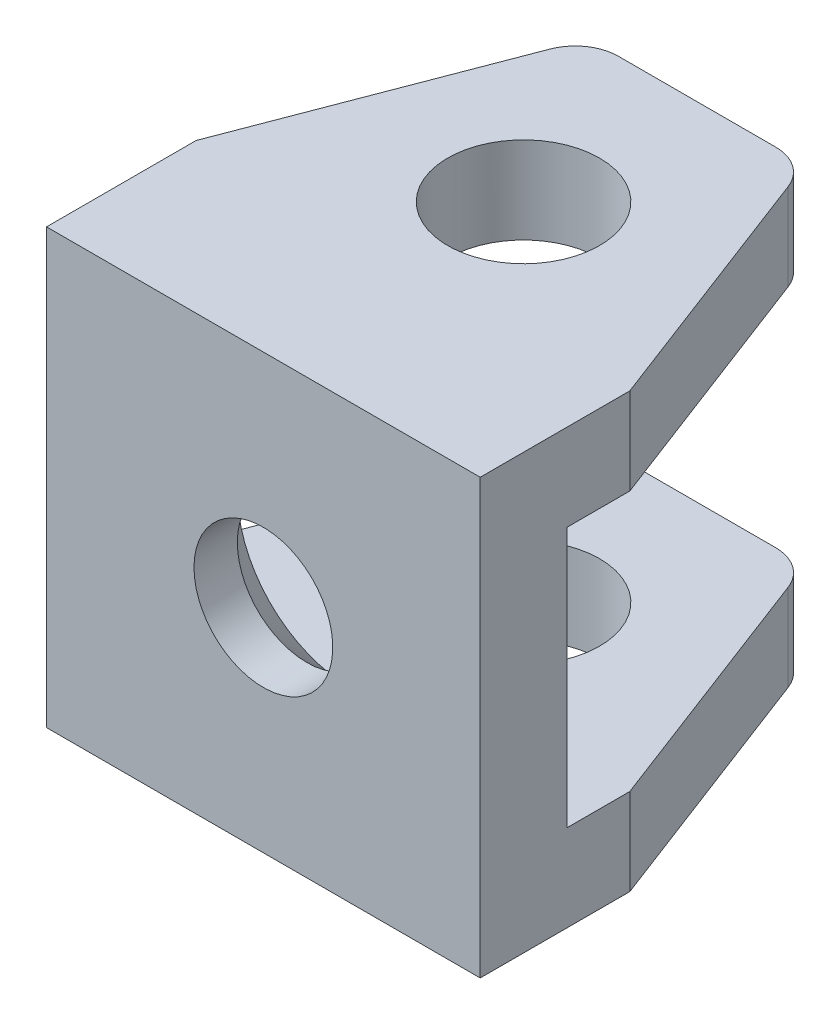
ISO-10303-21;
HEADER;
FILE_DESCRIPTION(('STEP AP214'),'2;1');
FILE_NAME('part.step','',(''),(''),'','','');
FILE_SCHEMA(('AUTOMOTIVE_DESIGN { 1 0 10303 214 1 1 1 1 }'));
ENDSEC;
DATA;
#1=APPLICATION_CONTEXT('core data for automotive mechanical design processes');
#2=APPLICATION_PROTOCOL_DEFINITION('international standard','automotive_design',2000,#1);
#3=PRODUCT_CONTEXT('',#1,'mechanical');
#4=PRODUCT('Part','Part','',(#3));
#5=PRODUCT_RELATED_PRODUCT_CATEGORY('part','',(#4));
#6=PRODUCT_DEFINITION_FORMATION('','',#4);
#7=PRODUCT_DEFINITION_CONTEXT('part definition',#1,'design');
#8=PRODUCT_DEFINITION('design','',#6,#7);
#9=PRODUCT_DEFINITION_SHAPE('','',#8);
#10=(LENGTH_UNIT() NAMED_UNIT(*) SI_UNIT(.MILLI.,.METRE.));
#11=(NAMED_UNIT(*) PLANE_ANGLE_UNIT() SI_UNIT($,.RADIAN.));
#12=(NAMED_UNIT(*) SI_UNIT($,.STERADIAN.) SOLID_ANGLE_UNIT());
#13=UNCERTAINTY_MEASURE_WITH_UNIT(LENGTH_MEASURE(1.E-05),#10,'distance_accuracy_value','');
#14=(GEOMETRIC_REPRESENTATION_CONTEXT(3) GLOBAL_UNCERTAINTY_ASSIGNED_CONTEXT((#13)) GLOBAL_UNIT_ASSIGNED_CONTEXT((#10,
#11,#12)) REPRESENTATION_CONTEXT('',''));
#15=CARTESIAN_POINT('',(0.,0.,0.));
#16=DIRECTION('',(0.,0.,1.));
#17=DIRECTION('',(1.,0.,0.));
#18=AXIS2_PLACEMENT_3D('',#15,#16,#17);
#19=CARTESIAN_POINT('',(2.5,10.,-5.));
#20=DIRECTION('',(-0.934277027827798,0.,0.356547942461117));
#21=DIRECTION('',(0.356547942461117,0.,0.934277027827798));
#22=AXIS2_PLACEMENT_3D('',#19,#20,#21);
#23=PLANE('',#22);
#24=DIRECTION('',(-0.356547942461117,0.,-0.934277027827798));
#25=VECTOR('',#24,1.);
#26=CARTESIAN_POINT('',(2.5,8.,-5.));
#27=LINE('',#26,#25);
#28=CARTESIAN_POINT('',(5.,8.,1.55085134820043));
#29=VERTEX_POINT('',#28);
#30=CARTESIAN_POINT('',(2.74556047120335,8.,-4.35654794246112));
#31=VERTEX_POINT('',#30);
#32=EDGE_CURVE('E218',#29,#31,#27,.T.);
#33=ORIENTED_EDGE('',*,*,#32,.T.);
#34=DIRECTION('',(0.,-1.,0.));
#35=VECTOR('',#34,1.);
#36=CARTESIAN_POINT('',(2.74556047120335,10.,-4.35654794246112));
#37=LINE('',#36,#35);
#38=CARTESIAN_POINT('',(2.74556047120335,10.,-4.35654794246112));
#39=VERTEX_POINT('',#38);
#40=EDGE_CURVE('E315',#31,#39,#37,.F.);
#41=ORIENTED_EDGE('',*,*,#40,.T.);
#42=DIRECTION('',(-0.356547942461117,0.,-0.934277027827798));
#43=VECTOR('',#42,1.);
#44=CARTESIAN_POINT('',(2.5,10.,-5.));
#45=LINE('',#44,#43);
#46=CARTESIAN_POINT('',(5.,10.,1.55085134820043));
#47=VERTEX_POINT('',#46);
#48=EDGE_CURVE('E234',#47,#39,#45,.T.);
#49=ORIENTED_EDGE('',*,*,#48,.F.);
#50=DIRECTION('',(0.,-1.,0.));
#51=VECTOR('',#50,1.);
#52=CARTESIAN_POINT('',(5.,10.,1.55085134820043));
#53=LINE('',#52,#51);
#54=EDGE_CURVE('E268',#47,#29,#53,.T.);
#55=ORIENTED_EDGE('',*,*,#54,.T.);
#56=EDGE_LOOP('',(#33,#41,#49,#55));
#57=FACE_BOUND('',#56,.T.);
#58=ADVANCED_FACE('F44',(#57),#23,.F.);
#59=CARTESIAN_POINT('',(-2.5,10.,-5.));
#60=DIRECTION('',(0.,0.,1.));
#61=DIRECTION('',(1.,0.,0.));
#62=AXIS2_PLACEMENT_3D('',#59,#60,#61);
#63=PLANE('',#62);
#64=DIRECTION('',(1.,0.,0.));
#65=VECTOR('',#64,1.);
#66=CARTESIAN_POINT('',(-5.,8.,-5.));
#67=LINE('',#66,#65);
#68=CARTESIAN_POINT('',(-1.81128344337555,8.,-5.));
#69=VERTEX_POINT('',#68);
#70=CARTESIAN_POINT('',(1.81128344337555,8.,-5.));
#71=VERTEX_POINT('',#70);
#72=EDGE_CURVE('E206',#69,#71,#67,.T.);
#73=ORIENTED_EDGE('',*,*,#72,.F.);
#74=DIRECTION('',(0.,-1.,0.));
#75=VECTOR('',#74,1.);
#76=CARTESIAN_POINT('',(-1.81128344337555,10.,-5.));
#77=LINE('',#76,#75);
#78=CARTESIAN_POINT('',(-1.81128344337555,10.,-5.));
#79=VERTEX_POINT('',#78);
#80=EDGE_CURVE('E306',#69,#79,#77,.F.);
#81=ORIENTED_EDGE('',*,*,#80,.T.);
#82=DIRECTION('',(-1.,0.,0.));
#83=VECTOR('',#82,1.);
#84=CARTESIAN_POINT('',(-2.5,10.,-5.));
#85=LINE('',#84,#83);
#86=CARTESIAN_POINT('',(1.81128344337555,10.,-5.));
#87=VERTEX_POINT('',#86);
#88=EDGE_CURVE('E238',#87,#79,#85,.T.);
#89=ORIENTED_EDGE('',*,*,#88,.F.);
#90=DIRECTION('',(0.,-1.,0.));
#91=VECTOR('',#90,1.);
#92=CARTESIAN_POINT('',(1.81128344337555,10.,-5.));
#93=LINE('',#92,#91);
#94=EDGE_CURVE('E302',#87,#71,#93,.T.);
#95=ORIENTED_EDGE('',*,*,#94,.T.);
#96=EDGE_LOOP('',(#73,#81,#89,#95));
#97=FACE_BOUND('',#96,.T.);
#98=ADVANCED_FACE('F357',(#97),#63,.F.);
#99=CARTESIAN_POINT('',(-2.5,10.,-5.));
#100=DIRECTION('',(0.934277027827798,0.,0.356547942461117));
#101=DIRECTION('',(0.356547942461117,0.,-0.934277027827798));
#102=AXIS2_PLACEMENT_3D('',#99,#100,#101);
#103=PLANE('',#102);
#104=DIRECTION('',(-0.356547942461117,0.,0.934277027827798));
#105=VECTOR('',#104,1.);
#106=CARTESIAN_POINT('',(-2.5,10.,-5.));
#107=LINE('',#106,#105);
#108=CARTESIAN_POINT('',(-2.74556047120335,10.,-4.35654794246112));
#109=VERTEX_POINT('',#108);
#110=CARTESIAN_POINT('',(-5.,10.,1.55085134820043));
#111=VERTEX_POINT('',#110);
#112=EDGE_CURVE('E242',#109,#111,#107,.T.);
#113=ORIENTED_EDGE('',*,*,#112,.F.);
#114=DIRECTION('',(0.,-1.,0.));
#115=VECTOR('',#114,1.);
#116=CARTESIAN_POINT('',(-2.74556047120335,10.,-4.35654794246112));
#117=LINE('',#116,#115);
#118=CARTESIAN_POINT('',(-2.74556047120335,8.,-4.35654794246112));
#119=VERTEX_POINT('',#118);
#120=EDGE_CURVE('E287',#109,#119,#117,.T.);
#121=ORIENTED_EDGE('',*,*,#120,.T.);
#122=DIRECTION('',(-0.356547942461117,0.,0.934277027827798));
#123=VECTOR('',#122,1.);
#124=CARTESIAN_POINT('',(-2.5,8.,-5.));
#125=LINE('',#124,#123);
#126=CARTESIAN_POINT('',(-5.,8.,1.55085134820042));
#127=VERTEX_POINT('',#126);
#128=EDGE_CURVE('E284',#119,#127,#125,.T.);
#129=ORIENTED_EDGE('',*,*,#128,.T.);
#130=DIRECTION('',(0.,-1.,0.));
#131=VECTOR('',#130,1.);
#132=CARTESIAN_POINT('',(-5.,10.,1.55085134820043));
#133=LINE('',#132,#131);
#134=EDGE_CURVE('E188',#111,#127,#133,.T.);
#135=ORIENTED_EDGE('',*,*,#134,.F.);
#136=EDGE_LOOP('',(#113,#121,#129,#135));
#137=FACE_BOUND('',#136,.T.);
#138=ADVANCED_FACE('F364',(#137),#103,.F.);
#139=CARTESIAN_POINT('',(-5.,10.,5.));
#140=DIRECTION('',(1.,0.,0.));
#141=DIRECTION('',(0.,0.,-1.));
#142=AXIS2_PLACEMENT_3D('',#139,#140,#141);
#143=PLANE('',#142);
#144=ORIENTED_EDGE('',*,*,#134,.T.);
#145=DIRECTION('',(0.,0.,1.));
#146=VECTOR('',#145,1.);
#147=CARTESIAN_POINT('',(-5.,8.,-5.));
#148=LINE('',#147,#146);
#149=CARTESIAN_POINT('',(-5.,8.,2.99999999999999));
#150=VERTEX_POINT('',#149);
#151=EDGE_CURVE('E166',#127,#150,#148,.T.);
#152=ORIENTED_EDGE('',*,*,#151,.T.);
#153=DIRECTION('',(0.,-1.,0.));
#154=VECTOR('',#153,1.);
#155=CARTESIAN_POINT('',(-5.,8.,2.99999999999999));
#156=LINE('',#155,#154);
#157=CARTESIAN_POINT('',(-5.,2.,2.99999999999999));
#158=VERTEX_POINT('',#157);
#159=EDGE_CURVE('E178',#150,#158,#156,.T.);
#160=ORIENTED_EDGE('',*,*,#159,.T.);
#161=DIRECTION('',(0.,0.,-1.));
#162=VECTOR('',#161,1.);
#163=CARTESIAN_POINT('',(-5.,2.,-5.));
#164=LINE('',#163,#162);
#165=CARTESIAN_POINT('',(-5.,2.,1.55085134820042));
#166=VERTEX_POINT('',#165);
#167=EDGE_CURVE('E175',#158,#166,#164,.T.);
#168=ORIENTED_EDGE('',*,*,#167,.T.);
#169=CARTESIAN_POINT('',(-5.,0.,1.55085134820043));
#170=VERTEX_POINT('',#169);
#171=EDGE_CURVE('E245',#166,#170,#133,.T.);
#172=ORIENTED_EDGE('',*,*,#171,.T.);
#173=DIRECTION('',(0.,0.,1.));
#174=VECTOR('',#173,1.);
#175=CARTESIAN_POINT('',(-5.,0.,5.));
#176=LINE('',#175,#174);
#177=CARTESIAN_POINT('',(-5.,0.,5.));
#178=VERTEX_POINT('',#177);
#179=EDGE_CURVE('E222',#170,#178,#176,.T.);
#180=ORIENTED_EDGE('',*,*,#179,.T.);
#181=DIRECTION('',(0.,-1.,0.));
#182=VECTOR('',#181,1.);
#183=CARTESIAN_POINT('',(-5.,10.,5.));
#184=LINE('',#183,#182);
#185=CARTESIAN_POINT('',(-5.,10.,5.));
#186=VERTEX_POINT('',#185);
#187=EDGE_CURVE('E276',#186,#178,#184,.T.);
#188=ORIENTED_EDGE('',*,*,#187,.F.);
#189=DIRECTION('',(0.,0.,1.));
#190=VECTOR('',#189,1.);
#191=CARTESIAN_POINT('',(-5.,10.,5.));
#192=LINE('',#191,#190);
#193=EDGE_CURVE('E223',#111,#186,#192,.T.);
#194=ORIENTED_EDGE('',*,*,#193,.F.);
#195=EDGE_LOOP('',(#144,#152,#160,#168,#172,#180,#188,#194));
#196=FACE_BOUND('',#195,.T.);
#197=ADVANCED_FACE('F185',(#196),#143,.F.);
#198=CARTESIAN_POINT('',(-5.,10.,5.));
#199=DIRECTION('',(0.,0.,-1.));
#200=DIRECTION('',(-1.,0.,0.));
#201=AXIS2_PLACEMENT_3D('',#198,#199,#200);
#202=PLANE('',#201);
#203=CARTESIAN_POINT('',(0.,4.90081416804579,5.));
#204=DIRECTION('',(0.,0.,-1.));
#205=DIRECTION('',(-1.,0.,0.));
#206=AXIS2_PLACEMENT_3D('',#203,#204,#205);
#207=CIRCLE('',#206,1.6);
#208=CARTESIAN_POINT('',(-1.6,4.90081416804579,5.));
#209=VERTEX_POINT('',#208);
#210=EDGE_CURVE('E625',#209,#209,#207,.T.);
#211=ORIENTED_EDGE('',*,*,#210,.T.);
#212=EDGE_LOOP('',(#211));
#213=FACE_BOUND('',#212,.T.);
#214=DIRECTION('',(1.,0.,0.));
#215=VECTOR('',#214,1.);
#216=CARTESIAN_POINT('',(-5.,0.,5.));
#217=LINE('',#216,#215);
#218=CARTESIAN_POINT('',(5.,0.,5.));
#219=VERTEX_POINT('',#218);
#220=EDGE_CURVE('E249',#178,#219,#217,.T.);
#221=ORIENTED_EDGE('',*,*,#220,.T.);
#222=DIRECTION('',(0.,-1.,0.));
#223=VECTOR('',#222,1.);
#224=CARTESIAN_POINT('',(5.,10.,5.));
#225=LINE('',#224,#223);
#226=CARTESIAN_POINT('',(5.,10.,5.));
#227=VERTEX_POINT('',#226);
#228=EDGE_CURVE('E272',#227,#219,#225,.T.);
#229=ORIENTED_EDGE('',*,*,#228,.F.);
#230=DIRECTION('',(1.,0.,0.));
#231=VECTOR('',#230,1.);
#232=CARTESIAN_POINT('',(-5.,10.,5.));
#233=LINE('',#232,#231);
#234=EDGE_CURVE('E227',#186,#227,#233,.T.);
#235=ORIENTED_EDGE('',*,*,#234,.F.);
#236=ORIENTED_EDGE('',*,*,#187,.T.);
#237=EDGE_LOOP('',(#221,#229,#235,#236));
#238=FACE_BOUND('',#237,.T.);
#239=ADVANCED_FACE('F377',(#213,#238),#202,.F.);
#240=CARTESIAN_POINT('',(5.,10.,5.));
#241=DIRECTION('',(-1.,0.,0.));
#242=DIRECTION('',(0.,0.,1.));
#243=AXIS2_PLACEMENT_3D('',#240,#241,#242);
#244=PLANE('',#243);
#245=DIRECTION('',(0.,-1.,0.));
#246=VECTOR('',#245,1.);
#247=CARTESIAN_POINT('',(5.,8.,3.));
#248=LINE('',#247,#246);
#249=CARTESIAN_POINT('',(5.,8.,3.));
#250=VERTEX_POINT('',#249);
#251=CARTESIAN_POINT('',(5.,2.,3.));
#252=VERTEX_POINT('',#251);
#253=EDGE_CURVE('E194',#250,#252,#248,.T.);
#254=ORIENTED_EDGE('',*,*,#253,.F.);
#255=DIRECTION('',(0.,0.,1.));
#256=VECTOR('',#255,1.);
#257=CARTESIAN_POINT('',(5.,8.,-5.));
#258=LINE('',#257,#256);
#259=EDGE_CURVE('E169',#29,#250,#258,.T.);
#260=ORIENTED_EDGE('',*,*,#259,.F.);
#261=ORIENTED_EDGE('',*,*,#54,.F.);
#262=DIRECTION('',(0.,0.,-1.));
#263=VECTOR('',#262,1.);
#264=CARTESIAN_POINT('',(5.,10.,5.));
#265=LINE('',#264,#263);
#266=EDGE_CURVE('E231',#227,#47,#265,.T.);
#267=ORIENTED_EDGE('',*,*,#266,.F.);
#268=ORIENTED_EDGE('',*,*,#228,.T.);
#269=DIRECTION('',(0.,0.,-1.));
#270=VECTOR('',#269,1.);
#271=CARTESIAN_POINT('',(5.,0.,5.));
#272=LINE('',#271,#270);
#273=CARTESIAN_POINT('',(5.,0.,1.55085134820043));
#274=VERTEX_POINT('',#273);
#275=EDGE_CURVE('E252',#219,#274,#272,.T.);
#276=ORIENTED_EDGE('',*,*,#275,.T.);
#277=CARTESIAN_POINT('',(5.,2.,1.55085134820043));
#278=VERTEX_POINT('',#277);
#279=EDGE_CURVE('E267',#278,#274,#53,.T.);
#280=ORIENTED_EDGE('',*,*,#279,.F.);
#281=DIRECTION('',(0.,0.,-1.));
#282=VECTOR('',#281,1.);
#283=CARTESIAN_POINT('',(5.,2.,-5.));
#284=LINE('',#283,#282);
#285=EDGE_CURVE('E190',#252,#278,#284,.T.);
#286=ORIENTED_EDGE('',*,*,#285,.F.);
#287=EDGE_LOOP('',(#254,#260,#261,#267,#268,#276,#280,#286));
#288=FACE_BOUND('',#287,.T.);
#289=ADVANCED_FACE('F370',(#288),#244,.F.);
#290=DIRECTION('',(-0.356547942461117,0.,-0.934277027827798));
#291=VECTOR('',#290,1.);
#292=CARTESIAN_POINT('',(2.5,0.,-5.));
#293=LINE('',#292,#291);
#294=CARTESIAN_POINT('',(2.74556047120335,0.,-4.35654794246112));
#295=VERTEX_POINT('',#294);
#296=EDGE_CURVE('E256',#274,#295,#293,.T.);
#297=ORIENTED_EDGE('',*,*,#296,.T.);
#298=DIRECTION('',(0.,-1.,0.));
#299=VECTOR('',#298,1.);
#300=CARTESIAN_POINT('',(2.74556047120335,10.,-4.35654794246112));
#301=LINE('',#300,#299);
#302=CARTESIAN_POINT('',(2.74556047120335,2.,-4.35654794246112));
#303=VERTEX_POINT('',#302);
#304=EDGE_CURVE('E61',#295,#303,#301,.F.);
#305=ORIENTED_EDGE('',*,*,#304,.T.);
#306=DIRECTION('',(0.356547942461117,0.,0.934277027827798));
#307=VECTOR('',#306,1.);
#308=CARTESIAN_POINT('',(2.5,2.,-5.));
#309=LINE('',#308,#307);
#310=EDGE_CURVE('E210',#303,#278,#309,.T.);
#311=ORIENTED_EDGE('',*,*,#310,.T.);
#312=ORIENTED_EDGE('',*,*,#279,.T.);
#313=EDGE_LOOP('',(#297,#305,#311,#312));
#314=FACE_BOUND('',#313,.T.);
#315=ADVANCED_FACE('F360',(#314),#23,.F.);
#316=DIRECTION('',(-1.,0.,0.));
#317=VECTOR('',#316,1.);
#318=CARTESIAN_POINT('',(-2.5,0.,-5.));
#319=LINE('',#318,#317);
#320=CARTESIAN_POINT('',(1.81128344337555,0.,-5.));
#321=VERTEX_POINT('',#320);
#322=CARTESIAN_POINT('',(-1.81128344337555,0.,-5.));
#323=VERTEX_POINT('',#322);
#324=EDGE_CURVE('E259',#321,#323,#319,.T.);
#325=ORIENTED_EDGE('',*,*,#324,.T.);
#326=DIRECTION('',(0.,-1.,0.));
#327=VECTOR('',#326,1.);
#328=CARTESIAN_POINT('',(-1.81128344337555,10.,-5.));
#329=LINE('',#328,#327);
#330=CARTESIAN_POINT('',(-1.81128344337555,2.,-5.));
#331=VERTEX_POINT('',#330);
#332=EDGE_CURVE('E332',#323,#331,#329,.F.);
#333=ORIENTED_EDGE('',*,*,#332,.T.);
#334=DIRECTION('',(1.,0.,0.));
#335=VECTOR('',#334,1.);
#336=CARTESIAN_POINT('',(-5.,2.,-5.));
#337=LINE('',#336,#335);
#338=CARTESIAN_POINT('',(1.81128344337555,2.,-5.));
#339=VERTEX_POINT('',#338);
#340=EDGE_CURVE('E211',#331,#339,#337,.T.);
#341=ORIENTED_EDGE('',*,*,#340,.T.);
#342=DIRECTION('',(0.,-1.,0.));
#343=VECTOR('',#342,1.);
#344=CARTESIAN_POINT('',(1.81128344337555,10.,-5.));
#345=LINE('',#344,#343);
#346=EDGE_CURVE('E328',#339,#321,#345,.T.);
#347=ORIENTED_EDGE('',*,*,#346,.T.);
#348=EDGE_LOOP('',(#325,#333,#341,#347));
#349=FACE_BOUND('',#348,.T.);
#350=ADVANCED_FACE('F367',(#349),#63,.F.);
#351=DIRECTION('',(0.356547942461117,0.,-0.934277027827798));
#352=VECTOR('',#351,1.);
#353=CARTESIAN_POINT('',(-2.5,2.,-5.));
#354=LINE('',#353,#352);
#355=CARTESIAN_POINT('',(-2.74556047120335,2.,-4.35654794246112));
#356=VERTEX_POINT('',#355);
#357=EDGE_CURVE('E280',#166,#356,#354,.T.);
#358=ORIENTED_EDGE('',*,*,#357,.T.);
#359=DIRECTION('',(0.,-1.,0.));
#360=VECTOR('',#359,1.);
#361=CARTESIAN_POINT('',(-2.74556047120335,10.,-4.35654794246112));
#362=LINE('',#361,#360);
#363=CARTESIAN_POINT('',(-2.74556047120335,0.,-4.35654794246112));
#364=VERTEX_POINT('',#363);
#365=EDGE_CURVE('E318',#356,#364,#362,.T.);
#366=ORIENTED_EDGE('',*,*,#365,.T.);
#367=DIRECTION('',(-0.356547942461117,0.,0.934277027827798));
#368=VECTOR('',#367,1.);
#369=CARTESIAN_POINT('',(-2.5,0.,-5.));
#370=LINE('',#369,#368);
#371=EDGE_CURVE('E228',#364,#170,#370,.T.);
#372=ORIENTED_EDGE('',*,*,#371,.T.);
#373=ORIENTED_EDGE('',*,*,#171,.F.);
#374=EDGE_LOOP('',(#358,#366,#372,#373));
#375=FACE_BOUND('',#374,.T.);
#376=ADVANCED_FACE('F375',(#375),#103,.F.);
#377=CARTESIAN_POINT('',(0.,10.,0.));
#378=DIRECTION('',(0.,-1.,0.));
#379=DIRECTION('',(0.,0.,-1.));
#380=AXIS2_PLACEMENT_3D('',#377,#378,#379);
#381=PLANE('',#380);
#382=CARTESIAN_POINT('',(0.,10.,-1.));
#383=DIRECTION('',(0.,-1.,0.));
#384=DIRECTION('',(0.,0.,-1.));
#385=AXIS2_PLACEMENT_3D('',#382,#383,#384);
#386=CIRCLE('',#385,1.75);
#387=CARTESIAN_POINT('',(0.,10.,-2.75));
#388=VERTEX_POINT('',#387);
#389=EDGE_CURVE('E292',#388,#388,#386,.T.);
#390=ORIENTED_EDGE('',*,*,#389,.T.);
#391=EDGE_LOOP('',(#390));
#392=FACE_BOUND('',#391,.T.);
#393=ORIENTED_EDGE('',*,*,#88,.T.);
#394=CARTESIAN_POINT('',(-1.81128344337555,10.,-4.));
#395=DIRECTION('',(0.,-1.,0.));
#396=DIRECTION('',(0.,0.,-1.));
#397=AXIS2_PLACEMENT_3D('',#394,#395,#396);
#398=CIRCLE('',#397,1.);
#399=EDGE_CURVE('E312',#79,#109,#398,.F.);
#400=ORIENTED_EDGE('',*,*,#399,.T.);
#401=ORIENTED_EDGE('',*,*,#112,.T.);
#402=ORIENTED_EDGE('',*,*,#193,.T.);
#403=ORIENTED_EDGE('',*,*,#234,.T.);
#404=ORIENTED_EDGE('',*,*,#266,.T.);
#405=ORIENTED_EDGE('',*,*,#48,.T.);
#406=CARTESIAN_POINT('',(1.81128344337555,10.,-4.));
#407=DIRECTION('',(0.,-1.,0.));
#408=DIRECTION('',(0.,0.,-1.));
#409=AXIS2_PLACEMENT_3D('',#406,#407,#408);
#410=CIRCLE('',#409,1.);
#411=EDGE_CURVE('E309',#39,#87,#410,.F.);
#412=ORIENTED_EDGE('',*,*,#411,.T.);
#413=EDGE_LOOP('',(#393,#400,#401,#402,#403,#404,#405,#412));
#414=FACE_BOUND('',#413,.T.);
#415=ADVANCED_FACE('F403',(#392,#414),#381,.F.);
#416=CARTESIAN_POINT('',(0.,0.,0.));
#417=DIRECTION('',(0.,-1.,0.));
#418=DIRECTION('',(0.,0.,-1.));
#419=AXIS2_PLACEMENT_3D('',#416,#417,#418);
#420=PLANE('',#419);
#421=CARTESIAN_POINT('',(0.,0.,-1.));
#422=DIRECTION('',(0.,-1.,0.));
#423=DIRECTION('',(0.,0.,-1.));
#424=AXIS2_PLACEMENT_3D('',#421,#422,#423);
#425=CIRCLE('',#424,1.75);
#426=CARTESIAN_POINT('',(0.,0.,-2.75));
#427=VERTEX_POINT('',#426);
#428=EDGE_CURVE('E627',#427,#427,#425,.T.);
#429=ORIENTED_EDGE('',*,*,#428,.F.);
#430=EDGE_LOOP('',(#429));
#431=FACE_BOUND('',#430,.T.);
#432=ORIENTED_EDGE('',*,*,#371,.F.);
#433=CARTESIAN_POINT('',(-1.81128344337555,0.,-4.));
#434=DIRECTION('',(0.,-1.,0.));
#435=DIRECTION('',(0.,0.,-1.));
#436=AXIS2_PLACEMENT_3D('',#433,#434,#435);
#437=CIRCLE('',#436,1.);
#438=EDGE_CURVE('E325',#364,#323,#437,.T.);
#439=ORIENTED_EDGE('',*,*,#438,.T.);
#440=ORIENTED_EDGE('',*,*,#324,.F.);
#441=CARTESIAN_POINT('',(1.81128344337555,0.,-4.));
#442=DIRECTION('',(0.,-1.,0.));
#443=DIRECTION('',(0.,0.,-1.));
#444=AXIS2_PLACEMENT_3D('',#441,#442,#443);
#445=CIRCLE('',#444,1.);
#446=EDGE_CURVE('E322',#321,#295,#445,.T.);
#447=ORIENTED_EDGE('',*,*,#446,.T.);
#448=ORIENTED_EDGE('',*,*,#296,.F.);
#449=ORIENTED_EDGE('',*,*,#275,.F.);
#450=ORIENTED_EDGE('',*,*,#220,.F.);
#451=ORIENTED_EDGE('',*,*,#179,.F.);
#452=EDGE_LOOP('',(#432,#439,#440,#447,#448,#449,#450,#451));
#453=FACE_BOUND('',#452,.T.);
#454=ADVANCED_FACE('F388',(#431,#453),#420,.T.);
#455=CARTESIAN_POINT('',(-5.,8.,-5.));
#456=DIRECTION('',(0.,1.,0.));
#457=DIRECTION('',(0.,0.,1.));
#458=AXIS2_PLACEMENT_3D('',#455,#456,#457);
#459=PLANE('',#458);
#460=CARTESIAN_POINT('',(0.,8.,-1.));
#461=DIRECTION('',(0.,1.,0.));
#462=DIRECTION('',(0.,0.,1.));
#463=AXIS2_PLACEMENT_3D('',#460,#461,#462);
#464=CIRCLE('',#463,1.75);
#465=CARTESIAN_POINT('',(0.,8.,0.75));
#466=VERTEX_POINT('',#465);
#467=EDGE_CURVE('E197',#466,#466,#464,.T.);
#468=ORIENTED_EDGE('',*,*,#467,.T.);
#469=EDGE_LOOP('',(#468));
#470=FACE_BOUND('',#469,.T.);
#471=ORIENTED_EDGE('',*,*,#128,.F.);
#472=CARTESIAN_POINT('',(-1.81128344337555,8.,-4.));
#473=DIRECTION('',(0.,1.,0.));
#474=DIRECTION('',(0.,0.,1.));
#475=AXIS2_PLACEMENT_3D('',#472,#473,#474);
#476=CIRCLE('',#475,1.);
#477=EDGE_CURVE('E299',#119,#69,#476,.F.);
#478=ORIENTED_EDGE('',*,*,#477,.T.);
#479=ORIENTED_EDGE('',*,*,#72,.T.);
#480=CARTESIAN_POINT('',(1.81128344337555,8.,-4.));
#481=DIRECTION('',(0.,1.,0.));
#482=DIRECTION('',(0.,0.,1.));
#483=AXIS2_PLACEMENT_3D('',#480,#481,#482);
#484=CIRCLE('',#483,1.);
#485=EDGE_CURVE('E296',#71,#31,#484,.F.);
#486=ORIENTED_EDGE('',*,*,#485,.T.);
#487=ORIENTED_EDGE('',*,*,#32,.F.);
#488=ORIENTED_EDGE('',*,*,#259,.T.);
#489=DIRECTION('',(1.,0.,0.));
#490=VECTOR('',#489,1.);
#491=CARTESIAN_POINT('',(-5.,8.,2.99999999999999));
#492=LINE('',#491,#490);
#493=EDGE_CURVE('E161',#150,#250,#492,.T.);
#494=ORIENTED_EDGE('',*,*,#493,.F.);
#495=ORIENTED_EDGE('',*,*,#151,.F.);
#496=EDGE_LOOP('',(#471,#478,#479,#486,#487,#488,#494,#495));
#497=FACE_BOUND('',#496,.T.);
#498=ADVANCED_FACE('F164',(#470,#497),#459,.F.);
#499=CARTESIAN_POINT('',(-5.,2.,-5.));
#500=DIRECTION('',(0.,-1.,0.));
#501=DIRECTION('',(0.,0.,-1.));
#502=AXIS2_PLACEMENT_3D('',#499,#500,#501);
#503=PLANE('',#502);
#504=CARTESIAN_POINT('',(0.,2.,-1.));
#505=DIRECTION('',(0.,-1.,0.));
#506=DIRECTION('',(0.,0.,-1.));
#507=AXIS2_PLACEMENT_3D('',#504,#505,#506);
#508=CIRCLE('',#507,1.75);
#509=CARTESIAN_POINT('',(0.,2.,-2.75));
#510=VERTEX_POINT('',#509);
#511=EDGE_CURVE('E288',#510,#510,#508,.T.);
#512=ORIENTED_EDGE('',*,*,#511,.T.);
#513=EDGE_LOOP('',(#512));
#514=FACE_BOUND('',#513,.T.);
#515=ORIENTED_EDGE('',*,*,#340,.F.);
#516=CARTESIAN_POINT('',(-1.81128344337555,2.,-4.));
#517=DIRECTION('',(0.,-1.,0.));
#518=DIRECTION('',(0.,0.,-1.));
#519=AXIS2_PLACEMENT_3D('',#516,#517,#518);
#520=CIRCLE('',#519,1.);
#521=EDGE_CURVE('E337',#331,#356,#520,.F.);
#522=ORIENTED_EDGE('',*,*,#521,.T.);
#523=ORIENTED_EDGE('',*,*,#357,.F.);
#524=ORIENTED_EDGE('',*,*,#167,.F.);
#525=DIRECTION('',(1.,0.,0.));
#526=VECTOR('',#525,1.);
#527=CARTESIAN_POINT('',(-5.,2.,2.99999999999999));
#528=LINE('',#527,#526);
#529=EDGE_CURVE('E174',#158,#252,#528,.T.);
#530=ORIENTED_EDGE('',*,*,#529,.T.);
#531=ORIENTED_EDGE('',*,*,#285,.T.);
#532=ORIENTED_EDGE('',*,*,#310,.F.);
#533=CARTESIAN_POINT('',(1.81128344337555,2.,-4.));
#534=DIRECTION('',(0.,-1.,0.));
#535=DIRECTION('',(0.,0.,-1.));
#536=AXIS2_PLACEMENT_3D('',#533,#534,#535);
#537=CIRCLE('',#536,1.);
#538=EDGE_CURVE('E68',#303,#339,#537,.F.);
#539=ORIENTED_EDGE('',*,*,#538,.T.);
#540=EDGE_LOOP('',(#515,#522,#523,#524,#530,#531,#532,#539));
#541=FACE_BOUND('',#540,.T.);
#542=ADVANCED_FACE('F397',(#514,#541),#503,.F.);
#543=CARTESIAN_POINT('',(-5.,8.,2.99999999999999));
#544=DIRECTION('',(0.,0.,1.));
#545=DIRECTION('',(1.,0.,0.));
#546=AXIS2_PLACEMENT_3D('',#543,#544,#545);
#547=PLANE('',#546);
#548=CARTESIAN_POINT('',(0.,4.90081416804579,3.));
#549=DIRECTION('',(0.,0.,1.));
#550=DIRECTION('',(1.,0.,0.));
#551=AXIS2_PLACEMENT_3D('',#548,#549,#550);
#552=CIRCLE('',#551,2.60000000000001);
#553=CARTESIAN_POINT('',(2.6,4.90081416804579,3.));
#554=VERTEX_POINT('',#553);
#555=EDGE_CURVE('E11',#554,#554,#552,.T.);
#556=ORIENTED_EDGE('',*,*,#555,.T.);
#557=EDGE_LOOP('',(#556));
#558=FACE_BOUND('',#557,.T.);
#559=ORIENTED_EDGE('',*,*,#253,.T.);
#560=ORIENTED_EDGE('',*,*,#529,.F.);
#561=ORIENTED_EDGE('',*,*,#159,.F.);
#562=ORIENTED_EDGE('',*,*,#493,.T.);
#563=EDGE_LOOP('',(#559,#560,#561,#562));
#564=FACE_BOUND('',#563,.T.);
#565=ADVANCED_FACE('F179',(#558,#564),#547,.F.);
#566=CARTESIAN_POINT('',(0.,10.,-1.));
#567=DIRECTION('',(0.,-1.,0.));
#568=DIRECTION('',(0.,0.,-1.));
#569=AXIS2_PLACEMENT_3D('',#566,#567,#568);
#570=CYLINDRICAL_SURFACE('',#569,1.75);
#571=ORIENTED_EDGE('',*,*,#428,.T.);
#572=EDGE_LOOP('',(#571));
#573=FACE_BOUND('',#572,.T.);
#574=ORIENTED_EDGE('',*,*,#511,.F.);
#575=EDGE_LOOP('',(#574));
#576=FACE_BOUND('',#575,.T.);
#577=ADVANCED_FACE('F424',(#573,#576),#570,.F.);
#578=ORIENTED_EDGE('',*,*,#389,.F.);
#579=EDGE_LOOP('',(#578));
#580=FACE_BOUND('',#579,.T.);
#581=ORIENTED_EDGE('',*,*,#467,.F.);
#582=EDGE_LOOP('',(#581));
#583=FACE_BOUND('',#582,.T.);
#584=ADVANCED_FACE('F416',(#580,#583),#570,.F.);
#585=CARTESIAN_POINT('',(-1.81128344337555,10.,-4.));
#586=DIRECTION('',(0.,-1.,0.));
#587=DIRECTION('',(0.,0.,-1.));
#588=AXIS2_PLACEMENT_3D('',#585,#586,#587);
#589=CYLINDRICAL_SURFACE('',#588,1.);
#590=ORIENTED_EDGE('',*,*,#399,.F.);
#591=ORIENTED_EDGE('',*,*,#80,.F.);
#592=ORIENTED_EDGE('',*,*,#477,.F.);
#593=ORIENTED_EDGE('',*,*,#120,.F.);
#594=EDGE_LOOP('',(#590,#591,#592,#593));
#595=FACE_BOUND('',#594,.T.);
#596=ADVANCED_FACE('F413',(#595),#589,.T.);
#597=CARTESIAN_POINT('',(1.81128344337555,10.,-4.));
#598=DIRECTION('',(0.,-1.,0.));
#599=DIRECTION('',(0.,0.,-1.));
#600=AXIS2_PLACEMENT_3D('',#597,#598,#599);
#601=CYLINDRICAL_SURFACE('',#600,1.);
#602=ORIENTED_EDGE('',*,*,#411,.F.);
#603=ORIENTED_EDGE('',*,*,#40,.F.);
#604=ORIENTED_EDGE('',*,*,#485,.F.);
#605=ORIENTED_EDGE('',*,*,#94,.F.);
#606=EDGE_LOOP('',(#602,#603,#604,#605));
#607=FACE_BOUND('',#606,.T.);
#608=ADVANCED_FACE('F415',(#607),#601,.T.);
#609=CARTESIAN_POINT('',(-1.81128344337555,10.,-4.));
#610=DIRECTION('',(0.,-1.,0.));
#611=DIRECTION('',(0.,0.,-1.));
#612=AXIS2_PLACEMENT_3D('',#609,#610,#611);
#613=CYLINDRICAL_SURFACE('',#612,1.);
#614=ORIENTED_EDGE('',*,*,#521,.F.);
#615=ORIENTED_EDGE('',*,*,#332,.F.);
#616=ORIENTED_EDGE('',*,*,#438,.F.);
#617=ORIENTED_EDGE('',*,*,#365,.F.);
#618=EDGE_LOOP('',(#614,#615,#616,#617));
#619=FACE_BOUND('',#618,.T.);
#620=ADVANCED_FACE('F393',(#619),#613,.T.);
#621=CARTESIAN_POINT('',(1.81128344337555,10.,-4.));
#622=DIRECTION('',(0.,-1.,0.));
#623=DIRECTION('',(0.,0.,-1.));
#624=AXIS2_PLACEMENT_3D('',#621,#622,#623);
#625=CYLINDRICAL_SURFACE('',#624,1.);
#626=ORIENTED_EDGE('',*,*,#538,.F.);
#627=ORIENTED_EDGE('',*,*,#304,.F.);
#628=ORIENTED_EDGE('',*,*,#446,.F.);
#629=ORIENTED_EDGE('',*,*,#346,.F.);
#630=EDGE_LOOP('',(#626,#627,#628,#629));
#631=FACE_BOUND('',#630,.T.);
#632=ADVANCED_FACE('F353',(#631),#625,.T.);
#633=CARTESIAN_POINT('',(0.,4.90081416804579,13.));
#634=DIRECTION('',(0.,0.,-1.));
#635=DIRECTION('',(-1.,0.,0.));
#636=AXIS2_PLACEMENT_3D('',#633,#634,#635);
#637=CYLINDRICAL_SURFACE('',#636,1.6);
#638=CARTESIAN_POINT('',(0.,4.90081416804579,4.));
#639=DIRECTION('',(0.,0.,1.));
#640=DIRECTION('',(1.,0.,0.));
#641=AXIS2_PLACEMENT_3D('',#638,#639,#640);
#642=CIRCLE('',#641,1.6);
#643=CARTESIAN_POINT('',(1.6,4.90081416804579,4.));
#644=VERTEX_POINT('',#643);
#645=EDGE_CURVE('E54',#644,#644,#642,.F.);
#646=ORIENTED_EDGE('',*,*,#645,.T.);
#647=EDGE_LOOP('',(#646));
#648=FACE_BOUND('',#647,.T.);
#649=ORIENTED_EDGE('',*,*,#210,.F.);
#650=EDGE_LOOP('',(#649));
#651=FACE_BOUND('',#650,.T.);
#652=ADVANCED_FACE('F345',(#648,#651),#637,.F.);
#653=CARTESIAN_POINT('',(0.,4.90081416804579,4.));
#654=DIRECTION('',(0.,0.,-1.));
#655=DIRECTION('',(-1.,0.,0.));
#656=AXIS2_PLACEMENT_3D('',#653,#654,#655);
#657=CONICAL_SURFACE('',#656,1.6,0.78539816339745);
#658=ORIENTED_EDGE('',*,*,#555,.F.);
#659=EDGE_LOOP('',(#658));
#660=FACE_BOUND('',#659,.T.);
#661=ORIENTED_EDGE('',*,*,#645,.F.);
#662=EDGE_LOOP('',(#661));
#663=FACE_BOUND('',#662,.T.);
#664=ADVANCED_FACE('F47',(#660,#663),#657,.F.);
#665=CLOSED_SHELL('',(#58,#98,#138,#197,#239,#289,#315,#350,#376,#415,#454,#498,#542,#565,#577,
#584,#596,#608,#620,#632,#652,#664));
#666=MANIFOLD_SOLID_BREP('B2',#665);
#667=ADVANCED_BREP_SHAPE_REPRESENTATION('',(#18,#666),#14);
#668=SHAPE_DEFINITION_REPRESENTATION(#9,#667);
ENDSEC;
END-ISO-10303-21;
